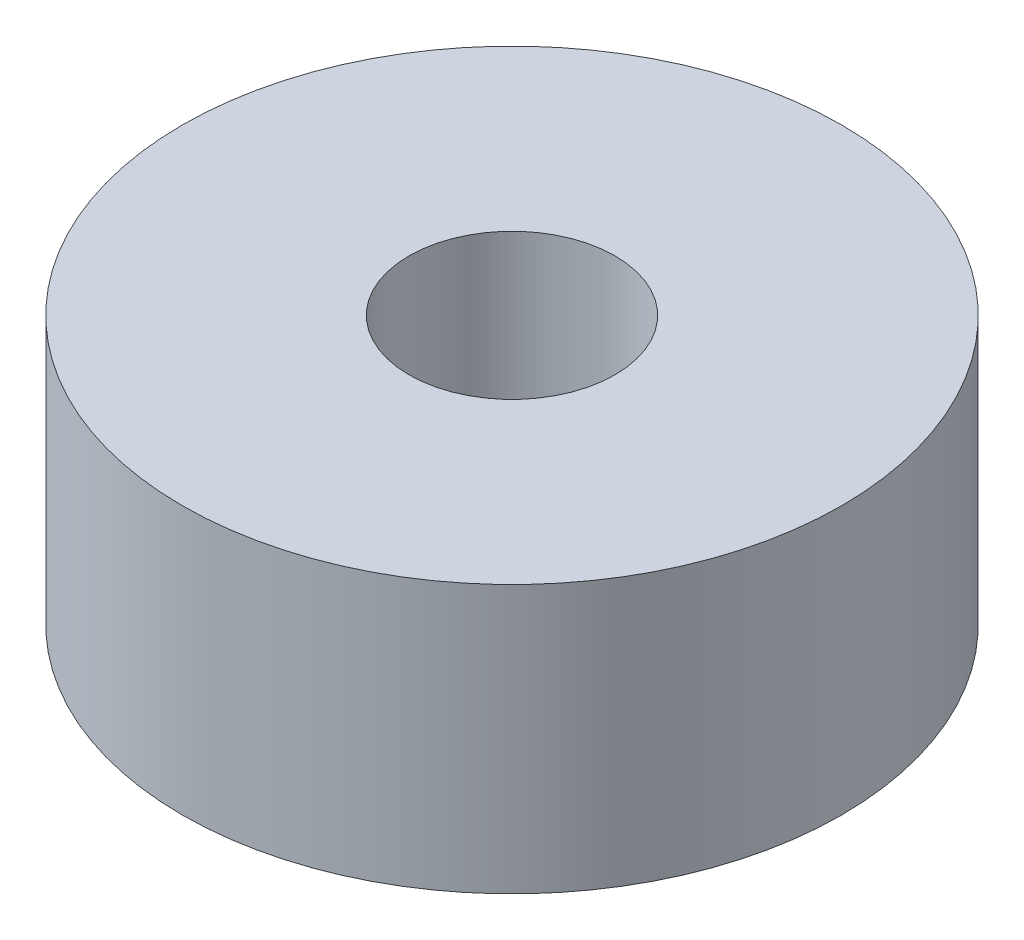
ISO-10303-21;
HEADER;
FILE_DESCRIPTION(('STEP AP214'),'2;1');
FILE_NAME('part.step','',(''),(''),'','','');
FILE_SCHEMA(('AUTOMOTIVE_DESIGN { 1 0 10303 214 1 1 1 1 }'));
ENDSEC;
DATA;
#1=APPLICATION_CONTEXT('core data for automotive mechanical design processes');
#2=APPLICATION_PROTOCOL_DEFINITION('international standard','automotive_design',2000,#1);
#3=PRODUCT_CONTEXT('',#1,'mechanical');
#4=PRODUCT('Part','Part','',(#3));
#5=PRODUCT_RELATED_PRODUCT_CATEGORY('part','',(#4));
#6=PRODUCT_DEFINITION_FORMATION('','',#4);
#7=PRODUCT_DEFINITION_CONTEXT('part definition',#1,'design');
#8=PRODUCT_DEFINITION('design','',#6,#7);
#9=PRODUCT_DEFINITION_SHAPE('','',#8);
#10=(LENGTH_UNIT() NAMED_UNIT(*) SI_UNIT(.MILLI.,.METRE.));
#11=(NAMED_UNIT(*) PLANE_ANGLE_UNIT() SI_UNIT($,.RADIAN.));
#12=(NAMED_UNIT(*) SI_UNIT($,.STERADIAN.) SOLID_ANGLE_UNIT());
#13=UNCERTAINTY_MEASURE_WITH_UNIT(LENGTH_MEASURE(1.E-05),#10,'distance_accuracy_value','');
#14=(GEOMETRIC_REPRESENTATION_CONTEXT(3) GLOBAL_UNCERTAINTY_ASSIGNED_CONTEXT((#13)) GLOBAL_UNIT_ASSIGNED_CONTEXT((#10,
#11,#12)) REPRESENTATION_CONTEXT('',''));
#15=CARTESIAN_POINT('',(0.,0.,0.));
#16=DIRECTION('',(0.,0.,1.));
#17=DIRECTION('',(1.,0.,0.));
#18=AXIS2_PLACEMENT_3D('',#15,#16,#17);
#19=CARTESIAN_POINT('',(0.,6.5,0.));
#20=DIRECTION('',(0.,1.,0.));
#21=DIRECTION('',(0.,0.,1.));
#22=AXIS2_PLACEMENT_3D('',#19,#20,#21);
#23=PLANE('',#22);
#24=CARTESIAN_POINT('',(0.,6.5,0.));
#25=DIRECTION('',(0.,1.,0.));
#26=DIRECTION('',(0.,0.,1.));
#27=AXIS2_PLACEMENT_3D('',#24,#25,#26);
#28=CIRCLE('',#27,8.);
#29=CARTESIAN_POINT('',(0.,6.5,-8.));
#30=VERTEX_POINT('',#29);
#31=EDGE_CURVE('E10',#30,#30,#28,.T.);
#32=ORIENTED_EDGE('',*,*,#31,.T.);
#33=EDGE_LOOP('',(#32));
#34=FACE_BOUND('',#33,.T.);
#35=CARTESIAN_POINT('',(0.,6.5,0.));
#36=DIRECTION('',(0.,1.,0.));
#37=DIRECTION('',(0.,0.,1.));
#38=AXIS2_PLACEMENT_3D('',#35,#36,#37);
#39=CIRCLE('',#38,2.5);
#40=CARTESIAN_POINT('',(0.,6.5,-2.5));
#41=VERTEX_POINT('',#40);
#42=EDGE_CURVE('E42',#41,#41,#39,.T.);
#43=ORIENTED_EDGE('',*,*,#42,.F.);
#44=EDGE_LOOP('',(#43));
#45=FACE_BOUND('',#44,.T.);
#46=ADVANCED_FACE('F31',(#34,#45),#23,.T.);
#47=CARTESIAN_POINT('',(0.,0.,0.));
#48=DIRECTION('',(0.,1.,0.));
#49=DIRECTION('',(0.,0.,1.));
#50=AXIS2_PLACEMENT_3D('',#47,#48,#49);
#51=PLANE('',#50);
#52=CARTESIAN_POINT('',(0.,0.,0.));
#53=DIRECTION('',(0.,1.,0.));
#54=DIRECTION('',(0.,0.,1.));
#55=AXIS2_PLACEMENT_3D('',#52,#53,#54);
#56=CIRCLE('',#55,8.);
#57=CARTESIAN_POINT('',(0.,0.,-8.));
#58=VERTEX_POINT('',#57);
#59=EDGE_CURVE('E35',#58,#58,#56,.T.);
#60=ORIENTED_EDGE('',*,*,#59,.F.);
#61=EDGE_LOOP('',(#60));
#62=FACE_BOUND('',#61,.T.);
#63=CARTESIAN_POINT('',(0.,0.,0.));
#64=DIRECTION('',(0.,1.,0.));
#65=DIRECTION('',(0.,0.,1.));
#66=AXIS2_PLACEMENT_3D('',#63,#64,#65);
#67=CIRCLE('',#66,2.5);
#68=CARTESIAN_POINT('',(0.,0.,-2.5));
#69=VERTEX_POINT('',#68);
#70=EDGE_CURVE('E44',#69,#69,#67,.T.);
#71=ORIENTED_EDGE('',*,*,#70,.T.);
#72=EDGE_LOOP('',(#71));
#73=FACE_BOUND('',#72,.T.);
#74=ADVANCED_FACE('F54',(#62,#73),#51,.F.);
#75=CARTESIAN_POINT('',(0.,6.5,0.));
#76=DIRECTION('',(0.,-1.,0.));
#77=DIRECTION('',(0.,0.,-1.));
#78=AXIS2_PLACEMENT_3D('',#75,#76,#77);
#79=CYLINDRICAL_SURFACE('',#78,8.);
#80=CARTESIAN_POINT('',(0.,6.5,-8.));
#81=CARTESIAN_POINT('',(0.,6.43229166666667,-8.));
#82=CARTESIAN_POINT('',(0.,6.36458333333333,-8.));
#83=CARTESIAN_POINT('',(0.,6.22916666666667,-8.));
#84=CARTESIAN_POINT('',(0.,6.16145833333333,-8.));
#85=CARTESIAN_POINT('',(0.,6.02604166666667,-8.));
#86=CARTESIAN_POINT('',(0.,5.95833333333333,-8.));
#87=CARTESIAN_POINT('',(0.,5.82291666666667,-8.));
#88=CARTESIAN_POINT('',(0.,5.75520833333333,-8.));
#89=CARTESIAN_POINT('',(0.,5.61979166666667,-8.));
#90=CARTESIAN_POINT('',(0.,5.55208333333333,-8.));
#91=CARTESIAN_POINT('',(0.,5.41666666666667,-8.));
#92=CARTESIAN_POINT('',(0.,5.34895833333333,-8.));
#93=CARTESIAN_POINT('',(0.,5.21354166666667,-8.));
#94=CARTESIAN_POINT('',(0.,5.14583333333333,-8.));
#95=CARTESIAN_POINT('',(0.,5.01041666666667,-8.));
#96=CARTESIAN_POINT('',(0.,4.94270833333333,-8.));
#97=CARTESIAN_POINT('',(0.,4.80729166666667,-8.));
#98=CARTESIAN_POINT('',(0.,4.73958333333333,-8.));
#99=CARTESIAN_POINT('',(0.,4.60416666666667,-8.));
#100=CARTESIAN_POINT('',(0.,4.53645833333333,-8.));
#101=CARTESIAN_POINT('',(0.,4.40104166666667,-8.));
#102=CARTESIAN_POINT('',(0.,4.33333333333333,-8.));
#103=CARTESIAN_POINT('',(0.,4.19791666666667,-8.));
#104=CARTESIAN_POINT('',(0.,4.13020833333333,-8.));
#105=CARTESIAN_POINT('',(0.,3.99479166666667,-8.));
#106=CARTESIAN_POINT('',(0.,3.92708333333333,-8.));
#107=CARTESIAN_POINT('',(0.,3.79166666666667,-8.));
#108=CARTESIAN_POINT('',(0.,3.72395833333333,-8.));
#109=CARTESIAN_POINT('',(0.,3.58854166666667,-8.));
#110=CARTESIAN_POINT('',(0.,3.52083333333333,-8.));
#111=CARTESIAN_POINT('',(0.,3.38541666666667,-8.));
#112=CARTESIAN_POINT('',(0.,3.31770833333333,-8.));
#113=CARTESIAN_POINT('',(0.,3.18229166666667,-8.));
#114=CARTESIAN_POINT('',(0.,3.11458333333333,-8.));
#115=CARTESIAN_POINT('',(0.,2.97916666666667,-8.));
#116=CARTESIAN_POINT('',(0.,2.91145833333333,-8.));
#117=CARTESIAN_POINT('',(0.,2.77604166666667,-8.));
#118=CARTESIAN_POINT('',(0.,2.70833333333333,-8.));
#119=CARTESIAN_POINT('',(0.,2.57291666666667,-8.));
#120=CARTESIAN_POINT('',(0.,2.50520833333333,-8.));
#121=CARTESIAN_POINT('',(0.,2.36979166666667,-8.));
#122=CARTESIAN_POINT('',(0.,2.30208333333333,-8.));
#123=CARTESIAN_POINT('',(0.,2.16666666666667,-8.));
#124=CARTESIAN_POINT('',(0.,2.09895833333333,-8.));
#125=CARTESIAN_POINT('',(0.,1.96354166666667,-8.));
#126=CARTESIAN_POINT('',(0.,1.89583333333333,-8.));
#127=CARTESIAN_POINT('',(0.,1.76041666666667,-8.));
#128=CARTESIAN_POINT('',(0.,1.69270833333333,-8.));
#129=CARTESIAN_POINT('',(0.,1.55729166666667,-8.));
#130=CARTESIAN_POINT('',(0.,1.48958333333333,-8.));
#131=CARTESIAN_POINT('',(0.,1.35416666666667,-8.));
#132=CARTESIAN_POINT('',(0.,1.28645833333333,-8.));
#133=CARTESIAN_POINT('',(0.,1.15104166666667,-8.));
#134=CARTESIAN_POINT('',(0.,1.08333333333333,-8.));
#135=CARTESIAN_POINT('',(0.,0.947916666666667,-8.));
#136=CARTESIAN_POINT('',(0.,0.880208333333333,-8.));
#137=CARTESIAN_POINT('',(0.,0.744791666666667,-8.));
#138=CARTESIAN_POINT('',(0.,0.677083333333333,-8.));
#139=CARTESIAN_POINT('',(0.,0.541666666666667,-8.));
#140=CARTESIAN_POINT('',(0.,0.473958333333333,-8.));
#141=CARTESIAN_POINT('',(0.,0.338541666666667,-8.));
#142=CARTESIAN_POINT('',(0.,0.270833333333334,-8.));
#143=CARTESIAN_POINT('',(0.,0.135416666666667,-8.));
#144=CARTESIAN_POINT('',(0.,0.0677083333333334,-8.));
#145=CARTESIAN_POINT('',(0.,0.,-8.));
#146=B_SPLINE_CURVE_WITH_KNOTS('',3,(#80,#81,#82,#83,#84,#85,#86,#87,#88,#89,#90,#91,#92,#93,
#94,#95,#96,#97,#98,#99,#100,#101,#102,#103,#104,#105,#106,#107,#108,#109,#110,#111,#112,#113,
#114,#115,#116,#117,#118,#119,#120,#121,#122,#123,#124,#125,#126,#127,#128,#129,#130,#131,#132,
#133,#134,#135,#136,#137,#138,#139,#140,#141,#142,#143,#144,#145),.UNSPECIFIED.,.F.,.F.,(4,2,2,
2,2,2,2,2,2,2,2,2,2,2,2,2,2,2,2,2,2,2,2,2,2,2,2,2,2,2,2,2,4),(0.,0.203124999999999,0.40625,
0.609375,0.812499999999999,1.015625,1.21875,1.421875,1.625,1.828125,2.03125,2.234375,2.4375,
2.640625,2.84375,3.046875,3.25,3.453125,3.65625,3.859375,4.0625,4.265625,4.46875,4.671875,4.875,
5.078125,5.28125,5.484375,5.6875,5.890625,6.09375,6.296875,6.5),.UNSPECIFIED.);
#147=EDGE_CURVE('BSEAM33',#30,#58,#146,.T.);
#148=ORIENTED_EDGE('',*,*,#31,.F.);
#149=ORIENTED_EDGE('',*,*,#59,.T.);
#150=ORIENTED_EDGE('',*,*,#147,.T.);
#151=ORIENTED_EDGE('',*,*,#147,.F.);
#152=EDGE_LOOP('',(#148,#150,#149,#151));
#153=FACE_BOUND('',#152,.T.);
#154=ADVANCED_FACE('F33',(#153),#79,.T.);
#155=CARTESIAN_POINT('',(0.,6.5,0.));
#156=DIRECTION('',(0.,-1.,0.));
#157=DIRECTION('',(0.,0.,-1.));
#158=AXIS2_PLACEMENT_3D('',#155,#156,#157);
#159=CYLINDRICAL_SURFACE('',#158,2.5);
#160=CARTESIAN_POINT('',(0.,6.5,-2.5));
#161=CARTESIAN_POINT('',(0.,6.43229166666667,-2.5));
#162=CARTESIAN_POINT('',(0.,6.36458333333333,-2.5));
#163=CARTESIAN_POINT('',(0.,6.22916666666667,-2.5));
#164=CARTESIAN_POINT('',(0.,6.16145833333333,-2.5));
#165=CARTESIAN_POINT('',(0.,6.02604166666667,-2.5));
#166=CARTESIAN_POINT('',(0.,5.95833333333333,-2.5));
#167=CARTESIAN_POINT('',(0.,5.82291666666667,-2.5));
#168=CARTESIAN_POINT('',(0.,5.75520833333333,-2.5));
#169=CARTESIAN_POINT('',(0.,5.61979166666667,-2.5));
#170=CARTESIAN_POINT('',(0.,5.55208333333333,-2.5));
#171=CARTESIAN_POINT('',(0.,5.41666666666667,-2.5));
#172=CARTESIAN_POINT('',(0.,5.34895833333333,-2.5));
#173=CARTESIAN_POINT('',(0.,5.21354166666667,-2.5));
#174=CARTESIAN_POINT('',(0.,5.14583333333333,-2.5));
#175=CARTESIAN_POINT('',(0.,5.01041666666667,-2.5));
#176=CARTESIAN_POINT('',(0.,4.94270833333333,-2.5));
#177=CARTESIAN_POINT('',(0.,4.80729166666667,-2.5));
#178=CARTESIAN_POINT('',(0.,4.73958333333333,-2.5));
#179=CARTESIAN_POINT('',(0.,4.60416666666667,-2.5));
#180=CARTESIAN_POINT('',(0.,4.53645833333333,-2.5));
#181=CARTESIAN_POINT('',(0.,4.40104166666667,-2.5));
#182=CARTESIAN_POINT('',(0.,4.33333333333333,-2.5));
#183=CARTESIAN_POINT('',(0.,4.19791666666667,-2.5));
#184=CARTESIAN_POINT('',(0.,4.13020833333333,-2.5));
#185=CARTESIAN_POINT('',(0.,3.99479166666667,-2.5));
#186=CARTESIAN_POINT('',(0.,3.92708333333333,-2.5));
#187=CARTESIAN_POINT('',(0.,3.79166666666667,-2.5));
#188=CARTESIAN_POINT('',(0.,3.72395833333333,-2.5));
#189=CARTESIAN_POINT('',(0.,3.58854166666667,-2.5));
#190=CARTESIAN_POINT('',(0.,3.52083333333333,-2.5));
#191=CARTESIAN_POINT('',(0.,3.38541666666667,-2.5));
#192=CARTESIAN_POINT('',(0.,3.31770833333333,-2.5));
#193=CARTESIAN_POINT('',(0.,3.18229166666667,-2.5));
#194=CARTESIAN_POINT('',(0.,3.11458333333333,-2.5));
#195=CARTESIAN_POINT('',(0.,2.97916666666667,-2.5));
#196=CARTESIAN_POINT('',(0.,2.91145833333333,-2.5));
#197=CARTESIAN_POINT('',(0.,2.77604166666667,-2.5));
#198=CARTESIAN_POINT('',(0.,2.70833333333333,-2.5));
#199=CARTESIAN_POINT('',(0.,2.57291666666667,-2.5));
#200=CARTESIAN_POINT('',(0.,2.50520833333333,-2.5));
#201=CARTESIAN_POINT('',(0.,2.36979166666667,-2.5));
#202=CARTESIAN_POINT('',(0.,2.30208333333333,-2.5));
#203=CARTESIAN_POINT('',(0.,2.16666666666667,-2.5));
#204=CARTESIAN_POINT('',(0.,2.09895833333333,-2.5));
#205=CARTESIAN_POINT('',(0.,1.96354166666667,-2.5));
#206=CARTESIAN_POINT('',(0.,1.89583333333333,-2.5));
#207=CARTESIAN_POINT('',(0.,1.76041666666667,-2.5));
#208=CARTESIAN_POINT('',(0.,1.69270833333333,-2.5));
#209=CARTESIAN_POINT('',(0.,1.55729166666667,-2.5));
#210=CARTESIAN_POINT('',(0.,1.48958333333333,-2.5));
#211=CARTESIAN_POINT('',(0.,1.35416666666667,-2.5));
#212=CARTESIAN_POINT('',(0.,1.28645833333333,-2.5));
#213=CARTESIAN_POINT('',(0.,1.15104166666667,-2.5));
#214=CARTESIAN_POINT('',(0.,1.08333333333333,-2.5));
#215=CARTESIAN_POINT('',(0.,0.947916666666667,-2.5));
#216=CARTESIAN_POINT('',(0.,0.880208333333333,-2.5));
#217=CARTESIAN_POINT('',(0.,0.744791666666667,-2.5));
#218=CARTESIAN_POINT('',(0.,0.677083333333333,-2.5));
#219=CARTESIAN_POINT('',(0.,0.541666666666667,-2.5));
#220=CARTESIAN_POINT('',(0.,0.473958333333333,-2.5));
#221=CARTESIAN_POINT('',(0.,0.338541666666667,-2.5));
#222=CARTESIAN_POINT('',(0.,0.270833333333334,-2.5));
#223=CARTESIAN_POINT('',(0.,0.135416666666667,-2.5));
#224=CARTESIAN_POINT('',(0.,0.0677083333333334,-2.5));
#225=CARTESIAN_POINT('',(0.,0.,-2.5));
#226=B_SPLINE_CURVE_WITH_KNOTS('',3,(#160,#161,#162,#163,#164,#165,#166,#167,#168,#169,#170,
#171,#172,#173,#174,#175,#176,#177,#178,#179,#180,#181,#182,#183,#184,#185,#186,#187,#188,#189,
#190,#191,#192,#193,#194,#195,#196,#197,#198,#199,#200,#201,#202,#203,#204,#205,#206,#207,#208,
#209,#210,#211,#212,#213,#214,#215,#216,#217,#218,#219,#220,#221,#222,#223,#224,#225),
.UNSPECIFIED.,.F.,.F.,(4,2,2,2,2,2,2,2,2,2,2,2,2,2,2,2,2,2,2,2,2,2,2,2,2,2,2,2,2,2,2,2,4),(0.,
0.203124999999999,0.40625,0.609375,0.812499999999999,1.015625,1.21875,1.421875,1.625,1.828125,
2.03125,2.234375,2.4375,2.640625,2.84375,3.046875,3.25,3.453125,3.65625,3.859375,4.0625,
4.265625,4.46875,4.671875,4.875,5.078125,5.28125,5.484375,5.6875,5.890625,6.09375,6.296875,6.5),.UNSPECIFIED.);
#227=EDGE_CURVE('BSEAM50',#41,#69,#226,.T.);
#228=ORIENTED_EDGE('',*,*,#42,.T.);
#229=ORIENTED_EDGE('',*,*,#70,.F.);
#230=ORIENTED_EDGE('',*,*,#227,.T.);
#231=ORIENTED_EDGE('',*,*,#227,.F.);
#232=EDGE_LOOP('',(#228,#230,#229,#231));
#233=FACE_BOUND('',#232,.T.);
#234=ADVANCED_FACE('F50',(#233),#159,.F.);
#235=CLOSED_SHELL('',(#46,#74,#154,#234));
#236=MANIFOLD_SOLID_BREP('B2',#235);
#237=ADVANCED_BREP_SHAPE_REPRESENTATION('',(#18,#236),#14);
#238=SHAPE_DEFINITION_REPRESENTATION(#9,#237);
ENDSEC;
END-ISO-10303-21;
